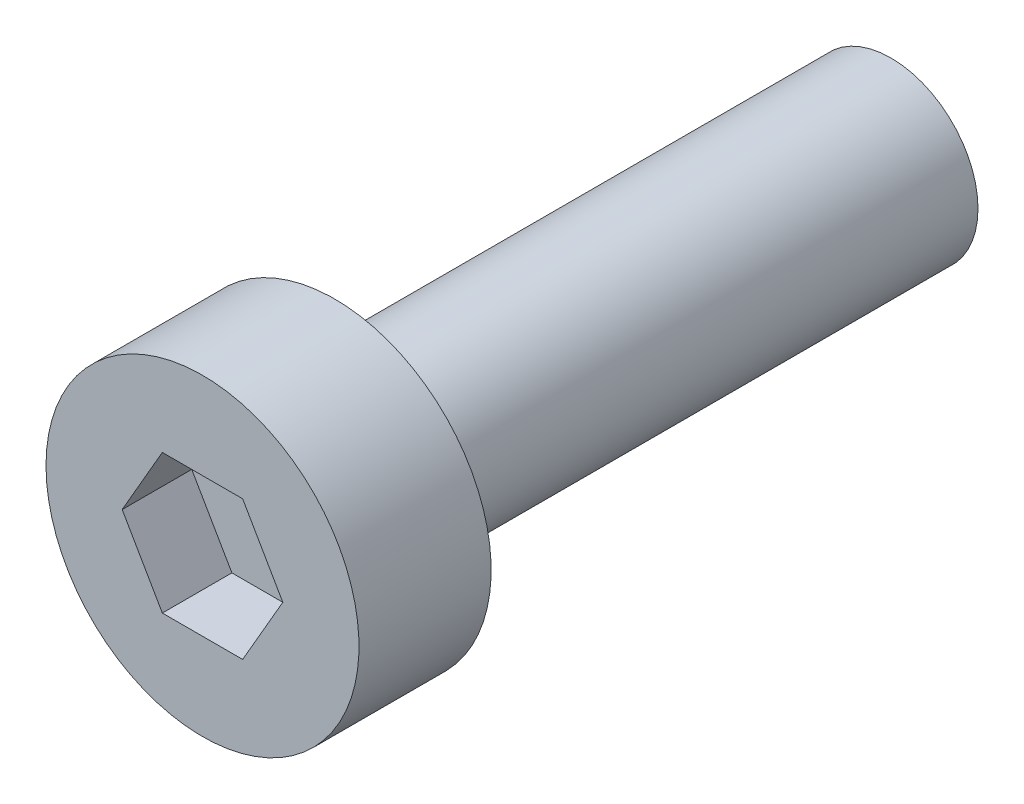
ISO-10303-21;
HEADER;
FILE_DESCRIPTION(('STEP AP214'),'2;1');
FILE_NAME('part.step','',(''),(''),'','','');
FILE_SCHEMA(('AUTOMOTIVE_DESIGN { 1 0 10303 214 1 1 1 1 }'));
ENDSEC;
DATA;
#1=APPLICATION_CONTEXT('core data for automotive mechanical design processes');
#2=APPLICATION_PROTOCOL_DEFINITION('international standard','automotive_design',2000,#1);
#3=PRODUCT_CONTEXT('',#1,'mechanical');
#4=PRODUCT('Part','Part','',(#3));
#5=PRODUCT_RELATED_PRODUCT_CATEGORY('part','',(#4));
#6=PRODUCT_DEFINITION_FORMATION('','',#4);
#7=PRODUCT_DEFINITION_CONTEXT('part definition',#1,'design');
#8=PRODUCT_DEFINITION('design','',#6,#7);
#9=PRODUCT_DEFINITION_SHAPE('','',#8);
#10=(LENGTH_UNIT() NAMED_UNIT(*) SI_UNIT(.MILLI.,.METRE.));
#11=(NAMED_UNIT(*) PLANE_ANGLE_UNIT() SI_UNIT($,.RADIAN.));
#12=(NAMED_UNIT(*) SI_UNIT($,.STERADIAN.) SOLID_ANGLE_UNIT());
#13=UNCERTAINTY_MEASURE_WITH_UNIT(LENGTH_MEASURE(1.E-05),#10,'distance_accuracy_value','');
#14=(GEOMETRIC_REPRESENTATION_CONTEXT(3) GLOBAL_UNCERTAINTY_ASSIGNED_CONTEXT((#13)) GLOBAL_UNIT_ASSIGNED_CONTEXT((#10,
#11,#12)) REPRESENTATION_CONTEXT('',''));
#15=CARTESIAN_POINT('',(0.,0.,0.));
#16=DIRECTION('',(0.,0.,1.));
#17=DIRECTION('',(1.,0.,0.));
#18=AXIS2_PLACEMENT_3D('',#15,#16,#17);
#19=CARTESIAN_POINT('',(0.,0.,8.));
#20=DIRECTION('',(0.,0.,-1.));
#21=DIRECTION('',(-1.,0.,0.));
#22=AXIS2_PLACEMENT_3D('',#19,#20,#21);
#23=CYLINDRICAL_SURFACE('',#22,1.25);
#24=CARTESIAN_POINT('',(0.,0.,8.));
#25=DIRECTION('',(0.,0.,1.));
#26=DIRECTION('',(1.,0.,0.));
#27=AXIS2_PLACEMENT_3D('',#24,#25,#26);
#28=CIRCLE('',#27,1.25);
#29=CARTESIAN_POINT('',(1.25,0.,8.));
#30=VERTEX_POINT('',#29);
#31=EDGE_CURVE('E11',#30,#30,#28,.T.);
#32=ORIENTED_EDGE('',*,*,#31,.F.);
#33=EDGE_LOOP('',(#32));
#34=FACE_BOUND('',#33,.T.);
#35=CARTESIAN_POINT('',(0.,0.,0.));
#36=DIRECTION('',(0.,0.,1.));
#37=DIRECTION('',(1.,0.,0.));
#38=AXIS2_PLACEMENT_3D('',#35,#36,#37);
#39=CIRCLE('',#38,1.25);
#40=CARTESIAN_POINT('',(1.25,0.,0.));
#41=VERTEX_POINT('',#40);
#42=EDGE_CURVE('E37',#41,#41,#39,.T.);
#43=ORIENTED_EDGE('',*,*,#42,.T.);
#44=EDGE_LOOP('',(#43));
#45=FACE_BOUND('',#44,.T.);
#46=ADVANCED_FACE('F34',(#34,#45),#23,.T.);
#47=CARTESIAN_POINT('',(0.,0.,0.));
#48=DIRECTION('',(0.,0.,1.));
#49=DIRECTION('',(1.,0.,0.));
#50=AXIS2_PLACEMENT_3D('',#47,#48,#49);
#51=PLANE('',#50);
#52=ORIENTED_EDGE('',*,*,#42,.F.);
#53=EDGE_LOOP('',(#52));
#54=FACE_BOUND('',#53,.T.);
#55=ADVANCED_FACE('F165',(#54),#51,.F.);
#56=CARTESIAN_POINT('',(0.,0.,9.9));
#57=DIRECTION('',(0.,0.,-1.));
#58=DIRECTION('',(-1.,0.,0.));
#59=AXIS2_PLACEMENT_3D('',#56,#57,#58);
#60=CYLINDRICAL_SURFACE('',#59,2.25);
#61=CARTESIAN_POINT('',(0.,0.,9.9));
#62=DIRECTION('',(0.,0.,1.));
#63=DIRECTION('',(1.,0.,0.));
#64=AXIS2_PLACEMENT_3D('',#61,#62,#63);
#65=CIRCLE('',#64,2.25);
#66=CARTESIAN_POINT('',(-2.25,0.,9.9));
#67=VERTEX_POINT('',#66);
#68=EDGE_CURVE('E141',#67,#67,#65,.T.);
#69=CARTESIAN_POINT('',(0.,0.,8.));
#70=DIRECTION('',(0.,0.,1.));
#71=DIRECTION('',(1.,0.,0.));
#72=AXIS2_PLACEMENT_3D('',#69,#70,#71);
#73=CIRCLE('',#72,2.25);
#74=CARTESIAN_POINT('',(-2.25,0.,8.));
#75=VERTEX_POINT('',#74);
#76=EDGE_CURVE('E135',#75,#75,#73,.T.);
#77=CARTESIAN_POINT('',(-2.25,0.,9.9));
#78=CARTESIAN_POINT('',(-2.25,0.,9.88020833333333));
#79=CARTESIAN_POINT('',(-2.25,0.,9.86041666666667));
#80=CARTESIAN_POINT('',(-2.25,0.,9.82083333333333));
#81=CARTESIAN_POINT('',(-2.25,0.,9.80104166666667));
#82=CARTESIAN_POINT('',(-2.25,0.,9.76145833333333));
#83=CARTESIAN_POINT('',(-2.25,0.,9.74166666666667));
#84=CARTESIAN_POINT('',(-2.25,0.,9.70208333333333));
#85=CARTESIAN_POINT('',(-2.25,0.,9.68229166666667));
#86=CARTESIAN_POINT('',(-2.25,0.,9.64270833333333));
#87=CARTESIAN_POINT('',(-2.25,0.,9.62291666666667));
#88=CARTESIAN_POINT('',(-2.25,0.,9.58333333333333));
#89=CARTESIAN_POINT('',(-2.25,0.,9.56354166666667));
#90=CARTESIAN_POINT('',(-2.25,0.,9.52395833333333));
#91=CARTESIAN_POINT('',(-2.25,0.,9.50416666666667));
#92=CARTESIAN_POINT('',(-2.25,0.,9.46458333333333));
#93=CARTESIAN_POINT('',(-2.25,0.,9.44479166666667));
#94=CARTESIAN_POINT('',(-2.25,0.,9.40520833333333));
#95=CARTESIAN_POINT('',(-2.25,0.,9.38541666666666));
#96=CARTESIAN_POINT('',(-2.25,0.,9.34583333333333));
#97=CARTESIAN_POINT('',(-2.25,0.,9.32604166666667));
#98=CARTESIAN_POINT('',(-2.25,0.,9.28645833333333));
#99=CARTESIAN_POINT('',(-2.25,0.,9.26666666666667));
#100=CARTESIAN_POINT('',(-2.25,0.,9.22708333333333));
#101=CARTESIAN_POINT('',(-2.25,0.,9.20729166666667));
#102=CARTESIAN_POINT('',(-2.25,0.,9.16770833333333));
#103=CARTESIAN_POINT('',(-2.25,0.,9.14791666666667));
#104=CARTESIAN_POINT('',(-2.25,0.,9.10833333333333));
#105=CARTESIAN_POINT('',(-2.25,0.,9.08854166666667));
#106=CARTESIAN_POINT('',(-2.25,0.,9.04895833333333));
#107=CARTESIAN_POINT('',(-2.25,0.,9.02916666666667));
#108=CARTESIAN_POINT('',(-2.25,0.,8.98958333333333));
#109=CARTESIAN_POINT('',(-2.25,0.,8.96979166666667));
#110=CARTESIAN_POINT('',(-2.25,0.,8.93020833333333));
#111=CARTESIAN_POINT('',(-2.25,0.,8.91041666666666));
#112=CARTESIAN_POINT('',(-2.25,0.,8.87083333333333));
#113=CARTESIAN_POINT('',(-2.25,0.,8.85104166666667));
#114=CARTESIAN_POINT('',(-2.25,0.,8.81145833333333));
#115=CARTESIAN_POINT('',(-2.25,0.,8.79166666666667));
#116=CARTESIAN_POINT('',(-2.25,0.,8.75208333333333));
#117=CARTESIAN_POINT('',(-2.25,0.,8.73229166666667));
#118=CARTESIAN_POINT('',(-2.25,0.,8.69270833333333));
#119=CARTESIAN_POINT('',(-2.25,0.,8.67291666666667));
#120=CARTESIAN_POINT('',(-2.25,0.,8.63333333333333));
#121=CARTESIAN_POINT('',(-2.25,0.,8.61354166666666));
#122=CARTESIAN_POINT('',(-2.25,0.,8.57395833333333));
#123=CARTESIAN_POINT('',(-2.25,0.,8.55416666666667));
#124=CARTESIAN_POINT('',(-2.25,0.,8.51458333333333));
#125=CARTESIAN_POINT('',(-2.25,0.,8.49479166666667));
#126=CARTESIAN_POINT('',(-2.25,0.,8.45520833333333));
#127=CARTESIAN_POINT('',(-2.25,0.,8.43541666666667));
#128=CARTESIAN_POINT('',(-2.25,0.,8.39583333333333));
#129=CARTESIAN_POINT('',(-2.25,0.,8.37604166666667));
#130=CARTESIAN_POINT('',(-2.25,0.,8.33645833333333));
#131=CARTESIAN_POINT('',(-2.25,0.,8.31666666666666));
#132=CARTESIAN_POINT('',(-2.25,0.,8.27708333333333));
#133=CARTESIAN_POINT('',(-2.25,0.,8.25729166666667));
#134=CARTESIAN_POINT('',(-2.25,0.,8.21770833333333));
#135=CARTESIAN_POINT('',(-2.25,0.,8.19791666666667));
#136=CARTESIAN_POINT('',(-2.25,0.,8.15833333333333));
#137=CARTESIAN_POINT('',(-2.25,0.,8.13854166666667));
#138=CARTESIAN_POINT('',(-2.25,0.,8.09895833333333));
#139=CARTESIAN_POINT('',(-2.25,0.,8.07916666666667));
#140=CARTESIAN_POINT('',(-2.25,0.,8.03958333333333));
#141=CARTESIAN_POINT('',(-2.25,0.,8.01979166666666));
#142=CARTESIAN_POINT('',(-2.25,0.,8.));
#143=B_SPLINE_CURVE_WITH_KNOTS('',3,(#77,#78,#79,#80,#81,#82,#83,#84,#85,#86,#87,#88,#89,#90,
#91,#92,#93,#94,#95,#96,#97,#98,#99,#100,#101,#102,#103,#104,#105,#106,#107,#108,#109,#110,#111,
#112,#113,#114,#115,#116,#117,#118,#119,#120,#121,#122,#123,#124,#125,#126,#127,#128,#129,#130,
#131,#132,#133,#134,#135,#136,#137,#138,#139,#140,#141,#142),.UNSPECIFIED.,.F.,.F.,(4,2,2,2,2,2,
2,2,2,2,2,2,2,2,2,2,2,2,2,2,2,2,2,2,2,2,2,2,2,2,2,2,4),(0.,0.0593749999999987,0.118749999999999,
0.178124999999999,0.2375,0.296874999999999,0.356249999999999,0.415624999999999,0.475,0.534375,
0.593749999999999,0.653124999999999,0.7125,0.771875,0.831249999999999,0.890624999999999,0.95,
1.009375,1.06875,1.128125,1.1875,1.246875,1.30625,1.365625,1.425,1.484375,1.54375,1.603125,
1.6625,1.721875,1.78125,1.840625,1.9),.UNSPECIFIED.);
#144=EDGE_CURVE('BSEAM147',#67,#75,#143,.T.);
#145=ORIENTED_EDGE('',*,*,#68,.F.);
#146=ORIENTED_EDGE('',*,*,#76,.T.);
#147=ORIENTED_EDGE('',*,*,#144,.T.);
#148=ORIENTED_EDGE('',*,*,#144,.F.);
#149=EDGE_LOOP('',(#145,#147,#146,#148));
#150=FACE_BOUND('',#149,.T.);
#151=ADVANCED_FACE('F147',(#150),#60,.T.);
#152=CARTESIAN_POINT('',(0.,0.,9.9));
#153=DIRECTION('',(0.,0.,1.));
#154=DIRECTION('',(1.,0.,0.));
#155=AXIS2_PLACEMENT_3D('',#152,#153,#154);
#156=PLANE('',#155);
#157=DIRECTION('',(0.5,0.866025403784439,0.));
#158=VECTOR('',#157,1.);
#159=CARTESIAN_POINT('',(0.577350269189626,-1.,9.9));
#160=LINE('',#159,#158);
#161=CARTESIAN_POINT('',(0.577350269189626,-1.,9.9));
#162=VERTEX_POINT('',#161);
#163=CARTESIAN_POINT('',(1.15470053837925,0.,9.9));
#164=VERTEX_POINT('',#163);
#165=EDGE_CURVE('E48',#162,#164,#160,.T.);
#166=ORIENTED_EDGE('',*,*,#165,.F.);
#167=DIRECTION('',(1.,0.,0.));
#168=VECTOR('',#167,1.);
#169=CARTESIAN_POINT('',(-0.577350269189626,-1.,9.9));
#170=LINE('',#169,#168);
#171=CARTESIAN_POINT('',(-0.577350269189626,-1.,9.9));
#172=VERTEX_POINT('',#171);
#173=EDGE_CURVE('E131',#172,#162,#170,.T.);
#174=ORIENTED_EDGE('',*,*,#173,.F.);
#175=DIRECTION('',(0.5,-0.866025403784439,0.));
#176=VECTOR('',#175,1.);
#177=CARTESIAN_POINT('',(-1.15470053837925,0.,9.9));
#178=LINE('',#177,#176);
#179=CARTESIAN_POINT('',(-1.15470053837925,0.,9.9));
#180=VERTEX_POINT('',#179);
#181=EDGE_CURVE('E129',#180,#172,#178,.T.);
#182=ORIENTED_EDGE('',*,*,#181,.F.);
#183=DIRECTION('',(-0.5,-0.866025403784439,0.));
#184=VECTOR('',#183,1.);
#185=CARTESIAN_POINT('',(-0.577350269189626,1.,9.9));
#186=LINE('',#185,#184);
#187=CARTESIAN_POINT('',(-0.577350269189626,1.,9.9));
#188=VERTEX_POINT('',#187);
#189=EDGE_CURVE('E96',#188,#180,#186,.T.);
#190=ORIENTED_EDGE('',*,*,#189,.F.);
#191=DIRECTION('',(-1.,0.,0.));
#192=VECTOR('',#191,1.);
#193=CARTESIAN_POINT('',(0.577350269189626,1.,9.9));
#194=LINE('',#193,#192);
#195=CARTESIAN_POINT('',(0.577350269189626,1.,9.9));
#196=VERTEX_POINT('',#195);
#197=EDGE_CURVE('E125',#196,#188,#194,.T.);
#198=ORIENTED_EDGE('',*,*,#197,.F.);
#199=DIRECTION('',(-0.5,0.866025403784438,0.));
#200=VECTOR('',#199,1.);
#201=CARTESIAN_POINT('',(1.15470053837925,0.,9.9));
#202=LINE('',#201,#200);
#203=EDGE_CURVE('E122',#164,#196,#202,.T.);
#204=ORIENTED_EDGE('',*,*,#203,.F.);
#205=EDGE_LOOP('',(#166,#174,#182,#190,#198,#204));
#206=FACE_BOUND('',#205,.T.);
#207=ORIENTED_EDGE('',*,*,#68,.T.);
#208=EDGE_LOOP('',(#207));
#209=FACE_BOUND('',#208,.T.);
#210=ADVANCED_FACE('F152',(#206,#209),#156,.T.);
#211=CARTESIAN_POINT('',(0.,0.,8.));
#212=DIRECTION('',(0.,0.,1.));
#213=DIRECTION('',(1.,0.,0.));
#214=AXIS2_PLACEMENT_3D('',#211,#212,#213);
#215=PLANE('',#214);
#216=ORIENTED_EDGE('',*,*,#31,.T.);
#217=EDGE_LOOP('',(#216));
#218=FACE_BOUND('',#217,.T.);
#219=ORIENTED_EDGE('',*,*,#76,.F.);
#220=EDGE_LOOP('',(#219));
#221=FACE_BOUND('',#220,.T.);
#222=ADVANCED_FACE('F149',(#218,#221),#215,.F.);
#223=CARTESIAN_POINT('',(0.577350269189626,-1.,8.9));
#224=DIRECTION('',(0.866025403784439,-0.5,0.));
#225=DIRECTION('',(0.5,0.866025403784439,0.));
#226=AXIS2_PLACEMENT_3D('',#223,#224,#225);
#227=PLANE('',#226);
#228=ORIENTED_EDGE('',*,*,#165,.T.);
#229=DIRECTION('',(0.,0.,1.));
#230=VECTOR('',#229,1.);
#231=CARTESIAN_POINT('',(1.15470053837925,0.,8.9));
#232=LINE('',#231,#230);
#233=CARTESIAN_POINT('',(1.15470053837925,0.,8.9));
#234=VERTEX_POINT('',#233);
#235=EDGE_CURVE('E78',#234,#164,#232,.T.);
#236=ORIENTED_EDGE('',*,*,#235,.F.);
#237=DIRECTION('',(0.5,0.866025403784439,0.));
#238=VECTOR('',#237,1.);
#239=CARTESIAN_POINT('',(0.577350269189626,-1.,8.9));
#240=LINE('',#239,#238);
#241=CARTESIAN_POINT('',(0.577350269189626,-1.,8.9));
#242=VERTEX_POINT('',#241);
#243=EDGE_CURVE('E133',#242,#234,#240,.T.);
#244=ORIENTED_EDGE('',*,*,#243,.F.);
#245=DIRECTION('',(0.,0.,1.));
#246=VECTOR('',#245,1.);
#247=CARTESIAN_POINT('',(0.577350269189626,-1.,8.9));
#248=LINE('',#247,#246);
#249=EDGE_CURVE('E56',#242,#162,#248,.T.);
#250=ORIENTED_EDGE('',*,*,#249,.T.);
#251=EDGE_LOOP('',(#228,#236,#244,#250));
#252=FACE_BOUND('',#251,.T.);
#253=ADVANCED_FACE('F151',(#252),#227,.F.);
#254=CARTESIAN_POINT('',(-0.577350269189626,-1.,8.9));
#255=DIRECTION('',(0.,-1.,0.));
#256=DIRECTION('',(0.,0.,-1.));
#257=AXIS2_PLACEMENT_3D('',#254,#255,#256);
#258=PLANE('',#257);
#259=ORIENTED_EDGE('',*,*,#173,.T.);
#260=ORIENTED_EDGE('',*,*,#249,.F.);
#261=DIRECTION('',(1.,0.,0.));
#262=VECTOR('',#261,1.);
#263=CARTESIAN_POINT('',(-0.577350269189626,-1.,8.9));
#264=LINE('',#263,#262);
#265=CARTESIAN_POINT('',(-0.577350269189626,-1.,8.9));
#266=VERTEX_POINT('',#265);
#267=EDGE_CURVE('E108',#266,#242,#264,.T.);
#268=ORIENTED_EDGE('',*,*,#267,.F.);
#269=DIRECTION('',(0.,0.,1.));
#270=VECTOR('',#269,1.);
#271=CARTESIAN_POINT('',(-0.577350269189626,-1.,8.9));
#272=LINE('',#271,#270);
#273=EDGE_CURVE('E100',#266,#172,#272,.T.);
#274=ORIENTED_EDGE('',*,*,#273,.T.);
#275=EDGE_LOOP('',(#259,#260,#268,#274));
#276=FACE_BOUND('',#275,.T.);
#277=ADVANCED_FACE('F159',(#276),#258,.F.);
#278=CARTESIAN_POINT('',(-1.15470053837925,0.,8.9));
#279=DIRECTION('',(-0.866025403784439,-0.5,0.));
#280=DIRECTION('',(0.5,-0.866025403784439,0.));
#281=AXIS2_PLACEMENT_3D('',#278,#279,#280);
#282=PLANE('',#281);
#283=ORIENTED_EDGE('',*,*,#181,.T.);
#284=ORIENTED_EDGE('',*,*,#273,.F.);
#285=DIRECTION('',(0.5,-0.866025403784439,0.));
#286=VECTOR('',#285,1.);
#287=CARTESIAN_POINT('',(-1.15470053837925,0.,8.9));
#288=LINE('',#287,#286);
#289=CARTESIAN_POINT('',(-1.15470053837925,0.,8.9));
#290=VERTEX_POINT('',#289);
#291=EDGE_CURVE('E104',#290,#266,#288,.T.);
#292=ORIENTED_EDGE('',*,*,#291,.F.);
#293=DIRECTION('',(0.,0.,1.));
#294=VECTOR('',#293,1.);
#295=CARTESIAN_POINT('',(-1.15470053837925,0.,8.9));
#296=LINE('',#295,#294);
#297=EDGE_CURVE('E89',#290,#180,#296,.T.);
#298=ORIENTED_EDGE('',*,*,#297,.T.);
#299=EDGE_LOOP('',(#283,#284,#292,#298));
#300=FACE_BOUND('',#299,.T.);
#301=ADVANCED_FACE('F105',(#300),#282,.F.);
#302=CARTESIAN_POINT('',(-0.577350269189626,1.,8.9));
#303=DIRECTION('',(-0.866025403784439,0.5,0.));
#304=DIRECTION('',(-0.5,-0.866025403784439,0.));
#305=AXIS2_PLACEMENT_3D('',#302,#303,#304);
#306=PLANE('',#305);
#307=ORIENTED_EDGE('',*,*,#189,.T.);
#308=ORIENTED_EDGE('',*,*,#297,.F.);
#309=DIRECTION('',(-0.5,-0.866025403784439,0.));
#310=VECTOR('',#309,1.);
#311=CARTESIAN_POINT('',(-0.577350269189626,1.,8.9));
#312=LINE('',#311,#310);
#313=CARTESIAN_POINT('',(-0.577350269189626,1.,8.9));
#314=VERTEX_POINT('',#313);
#315=EDGE_CURVE('E93',#314,#290,#312,.T.);
#316=ORIENTED_EDGE('',*,*,#315,.F.);
#317=DIRECTION('',(0.,0.,1.));
#318=VECTOR('',#317,1.);
#319=CARTESIAN_POINT('',(-0.577350269189626,1.,8.9));
#320=LINE('',#319,#318);
#321=EDGE_CURVE('E101',#314,#188,#320,.T.);
#322=ORIENTED_EDGE('',*,*,#321,.T.);
#323=EDGE_LOOP('',(#307,#308,#316,#322));
#324=FACE_BOUND('',#323,.T.);
#325=ADVANCED_FACE('F91',(#324),#306,.F.);
#326=CARTESIAN_POINT('',(0.577350269189626,1.,8.9));
#327=DIRECTION('',(0.,1.,0.));
#328=DIRECTION('',(0.,0.,1.));
#329=AXIS2_PLACEMENT_3D('',#326,#327,#328);
#330=PLANE('',#329);
#331=ORIENTED_EDGE('',*,*,#197,.T.);
#332=ORIENTED_EDGE('',*,*,#321,.F.);
#333=DIRECTION('',(-1.,0.,0.));
#334=VECTOR('',#333,1.);
#335=CARTESIAN_POINT('',(0.577350269189626,1.,8.9));
#336=LINE('',#335,#334);
#337=CARTESIAN_POINT('',(0.577350269189626,1.,8.9));
#338=VERTEX_POINT('',#337);
#339=EDGE_CURVE('E114',#338,#314,#336,.T.);
#340=ORIENTED_EDGE('',*,*,#339,.F.);
#341=DIRECTION('',(0.,0.,1.));
#342=VECTOR('',#341,1.);
#343=CARTESIAN_POINT('',(0.577350269189626,1.,8.9));
#344=LINE('',#343,#342);
#345=EDGE_CURVE('E138',#338,#196,#344,.T.);
#346=ORIENTED_EDGE('',*,*,#345,.T.);
#347=EDGE_LOOP('',(#331,#332,#340,#346));
#348=FACE_BOUND('',#347,.T.);
#349=ADVANCED_FACE('F220',(#348),#330,.F.);
#350=CARTESIAN_POINT('',(1.15470053837925,0.,8.9));
#351=DIRECTION('',(0.866025403784439,0.5,0.));
#352=DIRECTION('',(-0.5,0.866025403784438,0.));
#353=AXIS2_PLACEMENT_3D('',#350,#351,#352);
#354=PLANE('',#353);
#355=ORIENTED_EDGE('',*,*,#203,.T.);
#356=ORIENTED_EDGE('',*,*,#345,.F.);
#357=DIRECTION('',(-0.5,0.866025403784438,0.));
#358=VECTOR('',#357,1.);
#359=CARTESIAN_POINT('',(1.15470053837925,0.,8.9));
#360=LINE('',#359,#358);
#361=EDGE_CURVE('E116',#234,#338,#360,.T.);
#362=ORIENTED_EDGE('',*,*,#361,.F.);
#363=ORIENTED_EDGE('',*,*,#235,.T.);
#364=EDGE_LOOP('',(#355,#356,#362,#363));
#365=FACE_BOUND('',#364,.T.);
#366=ADVANCED_FACE('F229',(#365),#354,.F.);
#367=CARTESIAN_POINT('',(0.,0.,8.9));
#368=DIRECTION('',(0.,0.,1.));
#369=DIRECTION('',(1.,0.,0.));
#370=AXIS2_PLACEMENT_3D('',#367,#368,#369);
#371=PLANE('',#370);
#372=ORIENTED_EDGE('',*,*,#243,.T.);
#373=ORIENTED_EDGE('',*,*,#361,.T.);
#374=ORIENTED_EDGE('',*,*,#339,.T.);
#375=ORIENTED_EDGE('',*,*,#315,.T.);
#376=ORIENTED_EDGE('',*,*,#291,.T.);
#377=ORIENTED_EDGE('',*,*,#267,.T.);
#378=EDGE_LOOP('',(#372,#373,#374,#375,#376,#377));
#379=FACE_BOUND('',#378,.T.);
#380=ADVANCED_FACE('F111',(#379),#371,.T.);
#381=CLOSED_SHELL('',(#46,#55,#151,#210,#222,#253,#277,#301,#325,#349,#366,#380));
#382=MANIFOLD_SOLID_BREP('B2',#381);
#383=ADVANCED_BREP_SHAPE_REPRESENTATION('',(#18,#382),#14);
#384=SHAPE_DEFINITION_REPRESENTATION(#9,#383);
ENDSEC;
END-ISO-10303-21;
